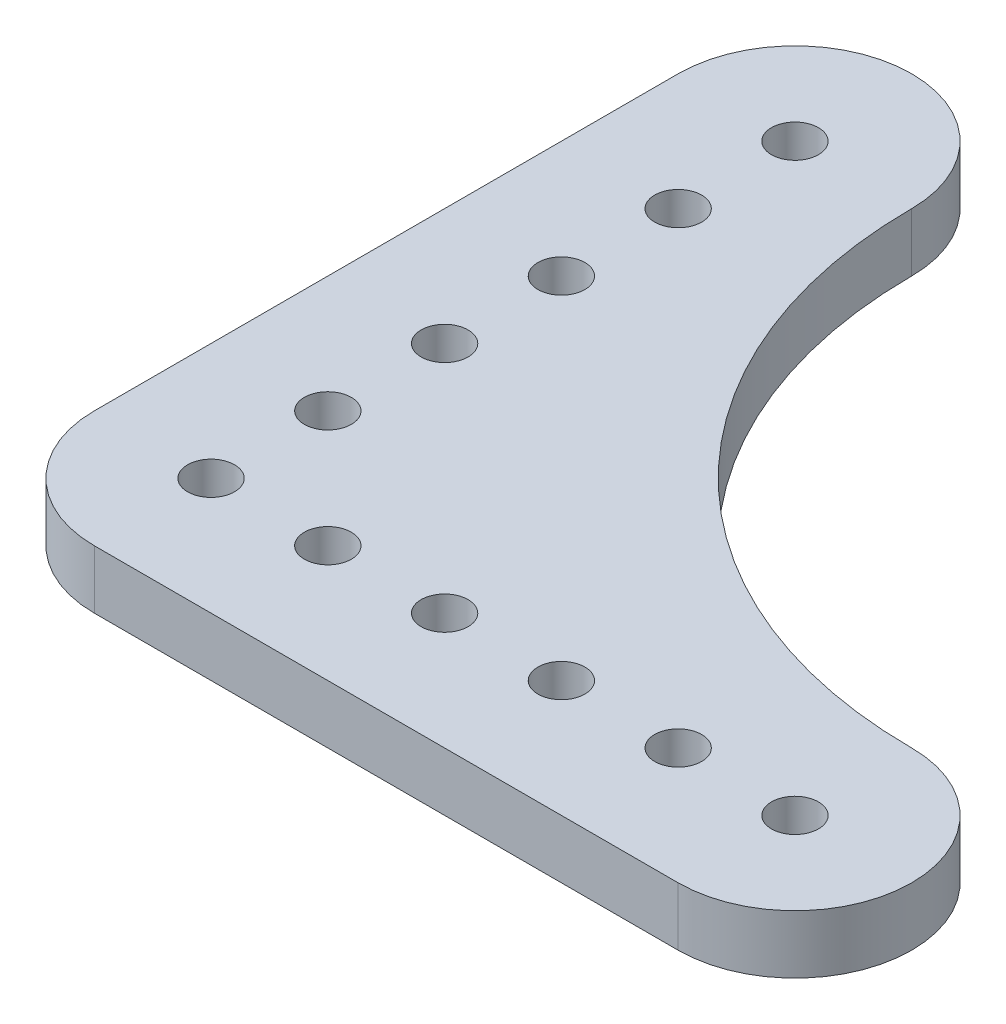
ISO-10303-21;
HEADER;
FILE_DESCRIPTION(('STEP AP214'),'2;1');
FILE_NAME('part.step','',(''),(''),'','','');
FILE_SCHEMA(('AUTOMOTIVE_DESIGN { 1 0 10303 214 1 1 1 1 }'));
ENDSEC;
DATA;
#1=APPLICATION_CONTEXT('core data for automotive mechanical design processes');
#2=APPLICATION_PROTOCOL_DEFINITION('international standard','automotive_design',2000,#1);
#3=PRODUCT_CONTEXT('',#1,'mechanical');
#4=PRODUCT('Part','Part','',(#3));
#5=PRODUCT_RELATED_PRODUCT_CATEGORY('part','',(#4));
#6=PRODUCT_DEFINITION_FORMATION('','',#4);
#7=PRODUCT_DEFINITION_CONTEXT('part definition',#1,'design');
#8=PRODUCT_DEFINITION('design','',#6,#7);
#9=PRODUCT_DEFINITION_SHAPE('','',#8);
#10=(LENGTH_UNIT() NAMED_UNIT(*) SI_UNIT(.MILLI.,.METRE.));
#11=(NAMED_UNIT(*) PLANE_ANGLE_UNIT() SI_UNIT($,.RADIAN.));
#12=(NAMED_UNIT(*) SI_UNIT($,.STERADIAN.) SOLID_ANGLE_UNIT());
#13=UNCERTAINTY_MEASURE_WITH_UNIT(LENGTH_MEASURE(1.E-05),#10,'distance_accuracy_value','');
#14=(GEOMETRIC_REPRESENTATION_CONTEXT(3) GLOBAL_UNCERTAINTY_ASSIGNED_CONTEXT((#13)) GLOBAL_UNIT_ASSIGNED_CONTEXT((#10,
#11,#12)) REPRESENTATION_CONTEXT('',''));
#15=CARTESIAN_POINT('',(0.,0.,0.));
#16=DIRECTION('',(0.,0.,1.));
#17=DIRECTION('',(1.,0.,0.));
#18=AXIS2_PLACEMENT_3D('',#15,#16,#17);
#19=CARTESIAN_POINT('',(-12.7,3.175,0.));
#20=DIRECTION('',(-1.,0.,0.));
#21=DIRECTION('',(0.,0.,1.));
#22=AXIS2_PLACEMENT_3D('',#19,#20,#21);
#23=PLANE('',#22);
#24=DIRECTION('',(0.,0.,-1.));
#25=VECTOR('',#24,1.);
#26=CARTESIAN_POINT('',(-12.7,-3.175,0.));
#27=LINE('',#26,#25);
#28=CARTESIAN_POINT('',(-12.7,-3.175,0.));
#29=VERTEX_POINT('',#28);
#30=CARTESIAN_POINT('',(-12.7,-3.175,-63.5));
#31=VERTEX_POINT('',#30);
#32=EDGE_CURVE('E150',#29,#31,#27,.T.);
#33=ORIENTED_EDGE('',*,*,#32,.F.);
#34=DIRECTION('',(0.,-1.,0.));
#35=VECTOR('',#34,1.);
#36=CARTESIAN_POINT('',(-12.7,3.175,0.));
#37=LINE('',#36,#35);
#38=CARTESIAN_POINT('',(-12.7,3.175,0.));
#39=VERTEX_POINT('',#38);
#40=EDGE_CURVE('E11',#39,#29,#37,.T.);
#41=ORIENTED_EDGE('',*,*,#40,.F.);
#42=DIRECTION('',(0.,0.,-1.));
#43=VECTOR('',#42,1.);
#44=CARTESIAN_POINT('',(-12.7,3.175,0.));
#45=LINE('',#44,#43);
#46=CARTESIAN_POINT('',(-12.7,3.175,-63.5));
#47=VERTEX_POINT('',#46);
#48=EDGE_CURVE('E208',#39,#47,#45,.T.);
#49=ORIENTED_EDGE('',*,*,#48,.T.);
#50=DIRECTION('',(0.,-1.,0.));
#51=VECTOR('',#50,1.);
#52=CARTESIAN_POINT('',(-12.7,3.175,-63.5));
#53=LINE('',#52,#51);
#54=EDGE_CURVE('E79',#47,#31,#53,.T.);
#55=ORIENTED_EDGE('',*,*,#54,.T.);
#56=EDGE_LOOP('',(#33,#41,#49,#55));
#57=FACE_BOUND('',#56,.T.);
#58=ADVANCED_FACE('F34',(#57),#23,.T.);
#59=CARTESIAN_POINT('',(0.,3.175,0.));
#60=DIRECTION('',(0.,-1.,0.));
#61=DIRECTION('',(0.,0.,-1.));
#62=AXIS2_PLACEMENT_3D('',#59,#60,#61);
#63=CYLINDRICAL_SURFACE('',#62,12.7);
#64=CARTESIAN_POINT('',(0.,-3.175,0.));
#65=DIRECTION('',(0.,1.,0.));
#66=DIRECTION('',(0.,0.,1.));
#67=AXIS2_PLACEMENT_3D('',#64,#65,#66);
#68=CIRCLE('',#67,12.7);
#69=CARTESIAN_POINT('',(0.,-3.175,12.7));
#70=VERTEX_POINT('',#69);
#71=EDGE_CURVE('E153',#29,#70,#68,.T.);
#72=ORIENTED_EDGE('',*,*,#71,.T.);
#73=DIRECTION('',(0.,-1.,0.));
#74=VECTOR('',#73,1.);
#75=CARTESIAN_POINT('',(0.,3.175,12.7));
#76=LINE('',#75,#74);
#77=CARTESIAN_POINT('',(0.,3.175,12.7));
#78=VERTEX_POINT('',#77);
#79=EDGE_CURVE('E43',#78,#70,#76,.T.);
#80=ORIENTED_EDGE('',*,*,#79,.F.);
#81=CARTESIAN_POINT('',(0.,3.175,0.));
#82=DIRECTION('',(0.,1.,0.));
#83=DIRECTION('',(0.,0.,1.));
#84=AXIS2_PLACEMENT_3D('',#81,#82,#83);
#85=CIRCLE('',#84,12.7);
#86=EDGE_CURVE('E209',#39,#78,#85,.T.);
#87=ORIENTED_EDGE('',*,*,#86,.F.);
#88=ORIENTED_EDGE('',*,*,#40,.T.);
#89=EDGE_LOOP('',(#72,#80,#87,#88));
#90=FACE_BOUND('',#89,.T.);
#91=ADVANCED_FACE('F203',(#90),#63,.T.);
#92=CARTESIAN_POINT('',(0.,3.175,12.7));
#93=DIRECTION('',(0.,0.,1.));
#94=DIRECTION('',(1.,0.,0.));
#95=AXIS2_PLACEMENT_3D('',#92,#93,#94);
#96=PLANE('',#95);
#97=DIRECTION('',(-1.,0.,0.));
#98=VECTOR('',#97,1.);
#99=CARTESIAN_POINT('',(0.,-3.175,12.7));
#100=LINE('',#99,#98);
#101=CARTESIAN_POINT('',(63.5,-3.175,12.7));
#102=VERTEX_POINT('',#101);
#103=EDGE_CURVE('E156',#102,#70,#100,.T.);
#104=ORIENTED_EDGE('',*,*,#103,.F.);
#105=DIRECTION('',(0.,-1.,0.));
#106=VECTOR('',#105,1.);
#107=CARTESIAN_POINT('',(63.5,3.175,12.7));
#108=LINE('',#107,#106);
#109=CARTESIAN_POINT('',(63.5,3.175,12.7));
#110=VERTEX_POINT('',#109);
#111=EDGE_CURVE('E110',#110,#102,#108,.T.);
#112=ORIENTED_EDGE('',*,*,#111,.F.);
#113=DIRECTION('',(-1.,0.,0.));
#114=VECTOR('',#113,1.);
#115=CARTESIAN_POINT('',(0.,3.175,12.7));
#116=LINE('',#115,#114);
#117=EDGE_CURVE('E99',#110,#78,#116,.T.);
#118=ORIENTED_EDGE('',*,*,#117,.T.);
#119=ORIENTED_EDGE('',*,*,#79,.T.);
#120=EDGE_LOOP('',(#104,#112,#118,#119));
#121=FACE_BOUND('',#120,.T.);
#122=ADVANCED_FACE('F200',(#121),#96,.T.);
#123=CARTESIAN_POINT('',(63.5,3.175,0.));
#124=DIRECTION('',(0.,-1.,0.));
#125=DIRECTION('',(0.,0.,-1.));
#126=AXIS2_PLACEMENT_3D('',#123,#124,#125);
#127=CYLINDRICAL_SURFACE('',#126,12.7);
#128=CARTESIAN_POINT('',(63.5,-3.175,0.));
#129=DIRECTION('',(0.,1.,0.));
#130=DIRECTION('',(0.,0.,1.));
#131=AXIS2_PLACEMENT_3D('',#128,#129,#130);
#132=CIRCLE('',#131,12.7);
#133=CARTESIAN_POINT('',(63.5,-3.175,-12.7));
#134=VERTEX_POINT('',#133);
#135=EDGE_CURVE('E106',#102,#134,#132,.T.);
#136=ORIENTED_EDGE('',*,*,#135,.T.);
#137=DIRECTION('',(0.,-1.,0.));
#138=VECTOR('',#137,1.);
#139=CARTESIAN_POINT('',(63.5,3.175,-12.7));
#140=LINE('',#139,#138);
#141=CARTESIAN_POINT('',(63.5,3.175,-12.7));
#142=VERTEX_POINT('',#141);
#143=EDGE_CURVE('E103',#142,#134,#140,.T.);
#144=ORIENTED_EDGE('',*,*,#143,.F.);
#145=CARTESIAN_POINT('',(63.5,3.175,0.));
#146=DIRECTION('',(0.,1.,0.));
#147=DIRECTION('',(0.,0.,1.));
#148=AXIS2_PLACEMENT_3D('',#145,#146,#147);
#149=CIRCLE('',#148,12.7);
#150=EDGE_CURVE('E92',#110,#142,#149,.T.);
#151=ORIENTED_EDGE('',*,*,#150,.F.);
#152=ORIENTED_EDGE('',*,*,#111,.T.);
#153=EDGE_LOOP('',(#136,#144,#151,#152));
#154=FACE_BOUND('',#153,.T.);
#155=ADVANCED_FACE('F104',(#154),#127,.T.);
#156=CARTESIAN_POINT('',(63.5,3.175,-63.5));
#157=DIRECTION('',(0.,-1.,0.));
#158=DIRECTION('',(0.,0.,-1.));
#159=AXIS2_PLACEMENT_3D('',#156,#157,#158);
#160=CYLINDRICAL_SURFACE('',#159,50.8);
#161=CARTESIAN_POINT('',(63.5,-3.175,-63.5));
#162=DIRECTION('',(0.,1.,0.));
#163=DIRECTION('',(0.,0.,1.));
#164=AXIS2_PLACEMENT_3D('',#161,#162,#163);
#165=CIRCLE('',#164,50.8);
#166=CARTESIAN_POINT('',(12.7,-3.175,-63.5));
#167=VERTEX_POINT('',#166);
#168=EDGE_CURVE('E160',#167,#134,#165,.T.);
#169=ORIENTED_EDGE('',*,*,#168,.F.);
#170=DIRECTION('',(0.,-1.,0.));
#171=VECTOR('',#170,1.);
#172=CARTESIAN_POINT('',(12.7,3.175,-63.5));
#173=LINE('',#172,#171);
#174=CARTESIAN_POINT('',(12.7,3.175,-63.5));
#175=VERTEX_POINT('',#174);
#176=EDGE_CURVE('E72',#175,#167,#173,.T.);
#177=ORIENTED_EDGE('',*,*,#176,.F.);
#178=CARTESIAN_POINT('',(63.5,3.175,-63.5));
#179=DIRECTION('',(0.,1.,0.));
#180=DIRECTION('',(0.,0.,1.));
#181=AXIS2_PLACEMENT_3D('',#178,#179,#180);
#182=CIRCLE('',#181,50.8);
#183=EDGE_CURVE('E97',#175,#142,#182,.T.);
#184=ORIENTED_EDGE('',*,*,#183,.T.);
#185=ORIENTED_EDGE('',*,*,#143,.T.);
#186=EDGE_LOOP('',(#169,#177,#184,#185));
#187=FACE_BOUND('',#186,.T.);
#188=ADVANCED_FACE('F112',(#187),#160,.F.);
#189=CARTESIAN_POINT('',(50.8,3.175,0.));
#190=DIRECTION('',(0.,-1.,0.));
#191=DIRECTION('',(0.,0.,-1.));
#192=AXIS2_PLACEMENT_3D('',#189,#190,#191);
#193=CYLINDRICAL_SURFACE('',#192,2.5527);
#194=CARTESIAN_POINT('',(50.8,3.175,0.));
#195=DIRECTION('',(0.,1.,0.));
#196=DIRECTION('',(0.,0.,1.));
#197=AXIS2_PLACEMENT_3D('',#194,#195,#196);
#198=CIRCLE('',#197,2.5527);
#199=CARTESIAN_POINT('',(50.8,3.175,2.5527));
#200=VERTEX_POINT('',#199);
#201=EDGE_CURVE('E141',#200,#200,#198,.T.);
#202=ORIENTED_EDGE('',*,*,#201,.T.);
#203=EDGE_LOOP('',(#202));
#204=FACE_BOUND('',#203,.T.);
#205=CARTESIAN_POINT('',(50.8,-3.175,0.));
#206=DIRECTION('',(0.,1.,0.));
#207=DIRECTION('',(0.,0.,1.));
#208=AXIS2_PLACEMENT_3D('',#205,#206,#207);
#209=CIRCLE('',#208,2.5527);
#210=CARTESIAN_POINT('',(50.8,-3.175,2.5527));
#211=VERTEX_POINT('',#210);
#212=EDGE_CURVE('E188',#211,#211,#209,.T.);
#213=ORIENTED_EDGE('',*,*,#212,.F.);
#214=EDGE_LOOP('',(#213));
#215=FACE_BOUND('',#214,.T.);
#216=ADVANCED_FACE('F241',(#204,#215),#193,.F.);
#217=CARTESIAN_POINT('',(38.1,3.175,0.));
#218=DIRECTION('',(0.,-1.,0.));
#219=DIRECTION('',(0.,0.,-1.));
#220=AXIS2_PLACEMENT_3D('',#217,#218,#219);
#221=CYLINDRICAL_SURFACE('',#220,2.5527);
#222=CARTESIAN_POINT('',(38.1,3.175,0.));
#223=DIRECTION('',(0.,1.,0.));
#224=DIRECTION('',(0.,0.,1.));
#225=AXIS2_PLACEMENT_3D('',#222,#223,#224);
#226=CIRCLE('',#225,2.5527);
#227=CARTESIAN_POINT('',(38.1,3.175,2.5527));
#228=VERTEX_POINT('',#227);
#229=EDGE_CURVE('E138',#228,#228,#226,.T.);
#230=ORIENTED_EDGE('',*,*,#229,.T.);
#231=EDGE_LOOP('',(#230));
#232=FACE_BOUND('',#231,.T.);
#233=CARTESIAN_POINT('',(38.1,-3.175,0.));
#234=DIRECTION('',(0.,1.,0.));
#235=DIRECTION('',(0.,0.,1.));
#236=AXIS2_PLACEMENT_3D('',#233,#234,#235);
#237=CIRCLE('',#236,2.5527);
#238=CARTESIAN_POINT('',(38.1,-3.175,2.5527));
#239=VERTEX_POINT('',#238);
#240=EDGE_CURVE('E185',#239,#239,#237,.T.);
#241=ORIENTED_EDGE('',*,*,#240,.F.);
#242=EDGE_LOOP('',(#241));
#243=FACE_BOUND('',#242,.T.);
#244=ADVANCED_FACE('F271',(#232,#243),#221,.F.);
#245=CARTESIAN_POINT('',(25.4,3.175,0.));
#246=DIRECTION('',(0.,-1.,0.));
#247=DIRECTION('',(0.,0.,-1.));
#248=AXIS2_PLACEMENT_3D('',#245,#246,#247);
#249=CYLINDRICAL_SURFACE('',#248,2.5527);
#250=CARTESIAN_POINT('',(25.4,3.175,0.));
#251=DIRECTION('',(0.,1.,0.));
#252=DIRECTION('',(0.,0.,1.));
#253=AXIS2_PLACEMENT_3D('',#250,#251,#252);
#254=CIRCLE('',#253,2.5527);
#255=CARTESIAN_POINT('',(25.4,3.175,2.5527));
#256=VERTEX_POINT('',#255);
#257=EDGE_CURVE('E135',#256,#256,#254,.T.);
#258=ORIENTED_EDGE('',*,*,#257,.T.);
#259=EDGE_LOOP('',(#258));
#260=FACE_BOUND('',#259,.T.);
#261=CARTESIAN_POINT('',(25.4,-3.175,0.));
#262=DIRECTION('',(0.,1.,0.));
#263=DIRECTION('',(0.,0.,1.));
#264=AXIS2_PLACEMENT_3D('',#261,#262,#263);
#265=CIRCLE('',#264,2.5527);
#266=CARTESIAN_POINT('',(25.4,-3.175,2.5527));
#267=VERTEX_POINT('',#266);
#268=EDGE_CURVE('E182',#267,#267,#265,.T.);
#269=ORIENTED_EDGE('',*,*,#268,.F.);
#270=EDGE_LOOP('',(#269));
#271=FACE_BOUND('',#270,.T.);
#272=ADVANCED_FACE('F267',(#260,#271),#249,.F.);
#273=CARTESIAN_POINT('',(0.,3.175,0.));
#274=DIRECTION('',(0.,-1.,0.));
#275=DIRECTION('',(0.,0.,-1.));
#276=AXIS2_PLACEMENT_3D('',#273,#274,#275);
#277=CYLINDRICAL_SURFACE('',#276,2.5527);
#278=CARTESIAN_POINT('',(0.,3.175,0.));
#279=DIRECTION('',(0.,1.,0.));
#280=DIRECTION('',(0.,0.,1.));
#281=AXIS2_PLACEMENT_3D('',#278,#279,#280);
#282=CIRCLE('',#281,2.5527);
#283=CARTESIAN_POINT('',(0.,3.175,2.5527));
#284=VERTEX_POINT('',#283);
#285=EDGE_CURVE('E132',#284,#284,#282,.T.);
#286=ORIENTED_EDGE('',*,*,#285,.T.);
#287=EDGE_LOOP('',(#286));
#288=FACE_BOUND('',#287,.T.);
#289=CARTESIAN_POINT('',(0.,-3.175,0.));
#290=DIRECTION('',(0.,1.,0.));
#291=DIRECTION('',(0.,0.,1.));
#292=AXIS2_PLACEMENT_3D('',#289,#290,#291);
#293=CIRCLE('',#292,2.5527);
#294=CARTESIAN_POINT('',(0.,-3.175,2.5527));
#295=VERTEX_POINT('',#294);
#296=EDGE_CURVE('E179',#295,#295,#293,.T.);
#297=ORIENTED_EDGE('',*,*,#296,.F.);
#298=EDGE_LOOP('',(#297));
#299=FACE_BOUND('',#298,.T.);
#300=ADVANCED_FACE('F263',(#288,#299),#277,.F.);
#301=CARTESIAN_POINT('',(0.,3.175,-12.7));
#302=DIRECTION('',(0.,-1.,0.));
#303=DIRECTION('',(0.,0.,-1.));
#304=AXIS2_PLACEMENT_3D('',#301,#302,#303);
#305=CYLINDRICAL_SURFACE('',#304,2.5527);
#306=CARTESIAN_POINT('',(0.,3.175,-12.7));
#307=DIRECTION('',(0.,1.,0.));
#308=DIRECTION('',(0.,0.,1.));
#309=AXIS2_PLACEMENT_3D('',#306,#307,#308);
#310=CIRCLE('',#309,2.5527);
#311=CARTESIAN_POINT('',(0.,3.175,-10.1473));
#312=VERTEX_POINT('',#311);
#313=EDGE_CURVE('E129',#312,#312,#310,.T.);
#314=ORIENTED_EDGE('',*,*,#313,.T.);
#315=EDGE_LOOP('',(#314));
#316=FACE_BOUND('',#315,.T.);
#317=CARTESIAN_POINT('',(0.,-3.175,-12.7));
#318=DIRECTION('',(0.,1.,0.));
#319=DIRECTION('',(0.,0.,1.));
#320=AXIS2_PLACEMENT_3D('',#317,#318,#319);
#321=CIRCLE('',#320,2.5527);
#322=CARTESIAN_POINT('',(0.,-3.175,-10.1473));
#323=VERTEX_POINT('',#322);
#324=EDGE_CURVE('E176',#323,#323,#321,.T.);
#325=ORIENTED_EDGE('',*,*,#324,.F.);
#326=EDGE_LOOP('',(#325));
#327=FACE_BOUND('',#326,.T.);
#328=ADVANCED_FACE('F259',(#316,#327),#305,.F.);
#329=CARTESIAN_POINT('',(0.,3.175,-63.5));
#330=DIRECTION('',(0.,-1.,0.));
#331=DIRECTION('',(0.,0.,-1.));
#332=AXIS2_PLACEMENT_3D('',#329,#330,#331);
#333=CYLINDRICAL_SURFACE('',#332,2.5527);
#334=CARTESIAN_POINT('',(0.,3.175,-63.5));
#335=DIRECTION('',(0.,1.,0.));
#336=DIRECTION('',(0.,0.,1.));
#337=AXIS2_PLACEMENT_3D('',#334,#335,#336);
#338=CIRCLE('',#337,2.5527);
#339=CARTESIAN_POINT('',(0.,3.175,-60.9473));
#340=VERTEX_POINT('',#339);
#341=EDGE_CURVE('E126',#340,#340,#338,.T.);
#342=ORIENTED_EDGE('',*,*,#341,.T.);
#343=EDGE_LOOP('',(#342));
#344=FACE_BOUND('',#343,.T.);
#345=CARTESIAN_POINT('',(0.,-3.175,-63.5));
#346=DIRECTION('',(0.,1.,0.));
#347=DIRECTION('',(0.,0.,1.));
#348=AXIS2_PLACEMENT_3D('',#345,#346,#347);
#349=CIRCLE('',#348,2.5527);
#350=CARTESIAN_POINT('',(0.,-3.175,-60.9473));
#351=VERTEX_POINT('',#350);
#352=EDGE_CURVE('E173',#351,#351,#349,.T.);
#353=ORIENTED_EDGE('',*,*,#352,.F.);
#354=EDGE_LOOP('',(#353));
#355=FACE_BOUND('',#354,.T.);
#356=ADVANCED_FACE('F255',(#344,#355),#333,.F.);
#357=CARTESIAN_POINT('',(0.,3.175,-50.8));
#358=DIRECTION('',(0.,-1.,0.));
#359=DIRECTION('',(0.,0.,-1.));
#360=AXIS2_PLACEMENT_3D('',#357,#358,#359);
#361=CYLINDRICAL_SURFACE('',#360,2.5527);
#362=CARTESIAN_POINT('',(0.,3.175,-50.8));
#363=DIRECTION('',(0.,1.,0.));
#364=DIRECTION('',(0.,0.,1.));
#365=AXIS2_PLACEMENT_3D('',#362,#363,#364);
#366=CIRCLE('',#365,2.5527);
#367=CARTESIAN_POINT('',(0.,3.175,-48.2473));
#368=VERTEX_POINT('',#367);
#369=EDGE_CURVE('E123',#368,#368,#366,.T.);
#370=ORIENTED_EDGE('',*,*,#369,.T.);
#371=EDGE_LOOP('',(#370));
#372=FACE_BOUND('',#371,.T.);
#373=CARTESIAN_POINT('',(0.,-3.175,-50.8));
#374=DIRECTION('',(0.,1.,0.));
#375=DIRECTION('',(0.,0.,1.));
#376=AXIS2_PLACEMENT_3D('',#373,#374,#375);
#377=CIRCLE('',#376,2.5527);
#378=CARTESIAN_POINT('',(0.,-3.175,-48.2473));
#379=VERTEX_POINT('',#378);
#380=EDGE_CURVE('E170',#379,#379,#377,.T.);
#381=ORIENTED_EDGE('',*,*,#380,.F.);
#382=EDGE_LOOP('',(#381));
#383=FACE_BOUND('',#382,.T.);
#384=ADVANCED_FACE('F251',(#372,#383),#361,.F.);
#385=CARTESIAN_POINT('',(0.,3.175,-38.1));
#386=DIRECTION('',(0.,-1.,0.));
#387=DIRECTION('',(0.,0.,-1.));
#388=AXIS2_PLACEMENT_3D('',#385,#386,#387);
#389=CYLINDRICAL_SURFACE('',#388,2.5527);
#390=CARTESIAN_POINT('',(0.,3.175,-38.1));
#391=DIRECTION('',(0.,1.,0.));
#392=DIRECTION('',(0.,0.,1.));
#393=AXIS2_PLACEMENT_3D('',#390,#391,#392);
#394=CIRCLE('',#393,2.5527);
#395=CARTESIAN_POINT('',(0.,3.175,-35.5473));
#396=VERTEX_POINT('',#395);
#397=EDGE_CURVE('E120',#396,#396,#394,.T.);
#398=ORIENTED_EDGE('',*,*,#397,.T.);
#399=EDGE_LOOP('',(#398));
#400=FACE_BOUND('',#399,.T.);
#401=CARTESIAN_POINT('',(0.,-3.175,-38.1));
#402=DIRECTION('',(0.,1.,0.));
#403=DIRECTION('',(0.,0.,1.));
#404=AXIS2_PLACEMENT_3D('',#401,#402,#403);
#405=CIRCLE('',#404,2.5527);
#406=CARTESIAN_POINT('',(0.,-3.175,-35.5473));
#407=VERTEX_POINT('',#406);
#408=EDGE_CURVE('E167',#407,#407,#405,.T.);
#409=ORIENTED_EDGE('',*,*,#408,.F.);
#410=EDGE_LOOP('',(#409));
#411=FACE_BOUND('',#410,.T.);
#412=ADVANCED_FACE('F247',(#400,#411),#389,.F.);
#413=CARTESIAN_POINT('',(0.,3.175,-25.4));
#414=DIRECTION('',(0.,-1.,0.));
#415=DIRECTION('',(0.,0.,-1.));
#416=AXIS2_PLACEMENT_3D('',#413,#414,#415);
#417=CYLINDRICAL_SURFACE('',#416,2.5527);
#418=CARTESIAN_POINT('',(0.,3.175,-25.4));
#419=DIRECTION('',(0.,1.,0.));
#420=DIRECTION('',(0.,0.,1.));
#421=AXIS2_PLACEMENT_3D('',#418,#419,#420);
#422=CIRCLE('',#421,2.5527);
#423=CARTESIAN_POINT('',(0.,3.175,-22.8473));
#424=VERTEX_POINT('',#423);
#425=EDGE_CURVE('E114',#424,#424,#422,.T.);
#426=ORIENTED_EDGE('',*,*,#425,.T.);
#427=EDGE_LOOP('',(#426));
#428=FACE_BOUND('',#427,.T.);
#429=CARTESIAN_POINT('',(0.,-3.175,-25.4));
#430=DIRECTION('',(0.,1.,0.));
#431=DIRECTION('',(0.,0.,1.));
#432=AXIS2_PLACEMENT_3D('',#429,#430,#431);
#433=CIRCLE('',#432,2.5527);
#434=CARTESIAN_POINT('',(0.,-3.175,-22.8473));
#435=VERTEX_POINT('',#434);
#436=EDGE_CURVE('E164',#435,#435,#433,.T.);
#437=ORIENTED_EDGE('',*,*,#436,.F.);
#438=EDGE_LOOP('',(#437));
#439=FACE_BOUND('',#438,.T.);
#440=ADVANCED_FACE('F244',(#428,#439),#417,.F.);
#441=CARTESIAN_POINT('',(0.,3.175,-63.5));
#442=DIRECTION('',(0.,-1.,0.));
#443=DIRECTION('',(0.,0.,-1.));
#444=AXIS2_PLACEMENT_3D('',#441,#442,#443);
#445=CYLINDRICAL_SURFACE('',#444,12.7);
#446=CARTESIAN_POINT('',(0.,-3.175,-63.5));
#447=DIRECTION('',(0.,1.,0.));
#448=DIRECTION('',(0.,0.,1.));
#449=AXIS2_PLACEMENT_3D('',#446,#447,#448);
#450=CIRCLE('',#449,12.7);
#451=EDGE_CURVE('E162',#167,#31,#450,.T.);
#452=ORIENTED_EDGE('',*,*,#451,.T.);
#453=ORIENTED_EDGE('',*,*,#54,.F.);
#454=CARTESIAN_POINT('',(0.,3.175,-63.5));
#455=DIRECTION('',(0.,1.,0.));
#456=DIRECTION('',(0.,0.,1.));
#457=AXIS2_PLACEMENT_3D('',#454,#455,#456);
#458=CIRCLE('',#457,12.7);
#459=EDGE_CURVE('E51',#175,#47,#458,.T.);
#460=ORIENTED_EDGE('',*,*,#459,.F.);
#461=ORIENTED_EDGE('',*,*,#176,.T.);
#462=EDGE_LOOP('',(#452,#453,#460,#461));
#463=FACE_BOUND('',#462,.T.);
#464=ADVANCED_FACE('F207',(#463),#445,.T.);
#465=CARTESIAN_POINT('',(12.7,3.175,0.));
#466=DIRECTION('',(0.,-1.,0.));
#467=DIRECTION('',(0.,0.,-1.));
#468=AXIS2_PLACEMENT_3D('',#465,#466,#467);
#469=CYLINDRICAL_SURFACE('',#468,2.5527);
#470=CARTESIAN_POINT('',(12.7,3.175,0.));
#471=DIRECTION('',(0.,1.,0.));
#472=DIRECTION('',(0.,0.,1.));
#473=AXIS2_PLACEMENT_3D('',#470,#471,#472);
#474=CIRCLE('',#473,2.5527);
#475=CARTESIAN_POINT('',(12.7,3.175,2.5527));
#476=VERTEX_POINT('',#475);
#477=EDGE_CURVE('E194',#476,#476,#474,.T.);
#478=ORIENTED_EDGE('',*,*,#477,.T.);
#479=EDGE_LOOP('',(#478));
#480=FACE_BOUND('',#479,.T.);
#481=CARTESIAN_POINT('',(12.7,-3.175,0.));
#482=DIRECTION('',(0.,1.,0.));
#483=DIRECTION('',(0.,0.,1.));
#484=AXIS2_PLACEMENT_3D('',#481,#482,#483);
#485=CIRCLE('',#484,2.5527);
#486=CARTESIAN_POINT('',(12.7,-3.175,2.5527));
#487=VERTEX_POINT('',#486);
#488=EDGE_CURVE('E147',#487,#487,#485,.T.);
#489=ORIENTED_EDGE('',*,*,#488,.F.);
#490=EDGE_LOOP('',(#489));
#491=FACE_BOUND('',#490,.T.);
#492=ADVANCED_FACE('F36',(#480,#491),#469,.F.);
#493=CARTESIAN_POINT('',(63.5,3.175,0.));
#494=DIRECTION('',(0.,-1.,0.));
#495=DIRECTION('',(0.,0.,-1.));
#496=AXIS2_PLACEMENT_3D('',#493,#494,#495);
#497=CYLINDRICAL_SURFACE('',#496,2.5527);
#498=CARTESIAN_POINT('',(63.5,3.175,0.));
#499=DIRECTION('',(0.,1.,0.));
#500=DIRECTION('',(0.,0.,1.));
#501=AXIS2_PLACEMENT_3D('',#498,#499,#500);
#502=CIRCLE('',#501,2.5527);
#503=CARTESIAN_POINT('',(63.5,3.175,2.5527));
#504=VERTEX_POINT('',#503);
#505=EDGE_CURVE('E144',#504,#504,#502,.T.);
#506=ORIENTED_EDGE('',*,*,#505,.T.);
#507=EDGE_LOOP('',(#506));
#508=FACE_BOUND('',#507,.T.);
#509=CARTESIAN_POINT('',(63.5,-3.175,0.));
#510=DIRECTION('',(0.,1.,0.));
#511=DIRECTION('',(0.,0.,1.));
#512=AXIS2_PLACEMENT_3D('',#509,#510,#511);
#513=CIRCLE('',#512,2.5527);
#514=CARTESIAN_POINT('',(63.5,-3.175,2.5527));
#515=VERTEX_POINT('',#514);
#516=EDGE_CURVE('E191',#515,#515,#513,.T.);
#517=ORIENTED_EDGE('',*,*,#516,.F.);
#518=EDGE_LOOP('',(#517));
#519=FACE_BOUND('',#518,.T.);
#520=ADVANCED_FACE('F219',(#508,#519),#497,.F.);
#521=CARTESIAN_POINT('',(0.,3.175,0.));
#522=DIRECTION('',(0.,1.,0.));
#523=DIRECTION('',(0.,0.,1.));
#524=AXIS2_PLACEMENT_3D('',#521,#522,#523);
#525=PLANE('',#524);
#526=ORIENTED_EDGE('',*,*,#477,.F.);
#527=EDGE_LOOP('',(#526));
#528=FACE_BOUND('',#527,.T.);
#529=ORIENTED_EDGE('',*,*,#48,.F.);
#530=ORIENTED_EDGE('',*,*,#86,.T.);
#531=ORIENTED_EDGE('',*,*,#117,.F.);
#532=ORIENTED_EDGE('',*,*,#150,.T.);
#533=ORIENTED_EDGE('',*,*,#183,.F.);
#534=ORIENTED_EDGE('',*,*,#459,.T.);
#535=EDGE_LOOP('',(#529,#530,#531,#532,#533,#534));
#536=FACE_BOUND('',#535,.T.);
#537=ORIENTED_EDGE('',*,*,#425,.F.);
#538=EDGE_LOOP('',(#537));
#539=FACE_BOUND('',#538,.T.);
#540=ORIENTED_EDGE('',*,*,#397,.F.);
#541=EDGE_LOOP('',(#540));
#542=FACE_BOUND('',#541,.T.);
#543=ORIENTED_EDGE('',*,*,#369,.F.);
#544=EDGE_LOOP('',(#543));
#545=FACE_BOUND('',#544,.T.);
#546=ORIENTED_EDGE('',*,*,#341,.F.);
#547=EDGE_LOOP('',(#546));
#548=FACE_BOUND('',#547,.T.);
#549=ORIENTED_EDGE('',*,*,#313,.F.);
#550=EDGE_LOOP('',(#549));
#551=FACE_BOUND('',#550,.T.);
#552=ORIENTED_EDGE('',*,*,#285,.F.);
#553=EDGE_LOOP('',(#552));
#554=FACE_BOUND('',#553,.T.);
#555=ORIENTED_EDGE('',*,*,#257,.F.);
#556=EDGE_LOOP('',(#555));
#557=FACE_BOUND('',#556,.T.);
#558=ORIENTED_EDGE('',*,*,#229,.F.);
#559=EDGE_LOOP('',(#558));
#560=FACE_BOUND('',#559,.T.);
#561=ORIENTED_EDGE('',*,*,#201,.F.);
#562=EDGE_LOOP('',(#561));
#563=FACE_BOUND('',#562,.T.);
#564=ORIENTED_EDGE('',*,*,#505,.F.);
#565=EDGE_LOOP('',(#564));
#566=FACE_BOUND('',#565,.T.);
#567=ADVANCED_FACE('F94',(#528,#536,#539,#542,#545,#548,#551,#554,#557,#560,#563,#566),#525,.T.);
#568=CARTESIAN_POINT('',(0.,-3.175,0.));
#569=DIRECTION('',(0.,1.,0.));
#570=DIRECTION('',(0.,0.,1.));
#571=AXIS2_PLACEMENT_3D('',#568,#569,#570);
#572=PLANE('',#571);
#573=ORIENTED_EDGE('',*,*,#488,.T.);
#574=EDGE_LOOP('',(#573));
#575=FACE_BOUND('',#574,.T.);
#576=ORIENTED_EDGE('',*,*,#32,.T.);
#577=ORIENTED_EDGE('',*,*,#451,.F.);
#578=ORIENTED_EDGE('',*,*,#168,.T.);
#579=ORIENTED_EDGE('',*,*,#135,.F.);
#580=ORIENTED_EDGE('',*,*,#103,.T.);
#581=ORIENTED_EDGE('',*,*,#71,.F.);
#582=EDGE_LOOP('',(#576,#577,#578,#579,#580,#581));
#583=FACE_BOUND('',#582,.T.);
#584=ORIENTED_EDGE('',*,*,#436,.T.);
#585=EDGE_LOOP('',(#584));
#586=FACE_BOUND('',#585,.T.);
#587=ORIENTED_EDGE('',*,*,#408,.T.);
#588=EDGE_LOOP('',(#587));
#589=FACE_BOUND('',#588,.T.);
#590=ORIENTED_EDGE('',*,*,#380,.T.);
#591=EDGE_LOOP('',(#590));
#592=FACE_BOUND('',#591,.T.);
#593=ORIENTED_EDGE('',*,*,#352,.T.);
#594=EDGE_LOOP('',(#593));
#595=FACE_BOUND('',#594,.T.);
#596=ORIENTED_EDGE('',*,*,#324,.T.);
#597=EDGE_LOOP('',(#596));
#598=FACE_BOUND('',#597,.T.);
#599=ORIENTED_EDGE('',*,*,#296,.T.);
#600=EDGE_LOOP('',(#599));
#601=FACE_BOUND('',#600,.T.);
#602=ORIENTED_EDGE('',*,*,#268,.T.);
#603=EDGE_LOOP('',(#602));
#604=FACE_BOUND('',#603,.T.);
#605=ORIENTED_EDGE('',*,*,#240,.T.);
#606=EDGE_LOOP('',(#605));
#607=FACE_BOUND('',#606,.T.);
#608=ORIENTED_EDGE('',*,*,#212,.T.);
#609=EDGE_LOOP('',(#608));
#610=FACE_BOUND('',#609,.T.);
#611=ORIENTED_EDGE('',*,*,#516,.T.);
#612=EDGE_LOOP('',(#611));
#613=FACE_BOUND('',#612,.T.);
#614=ADVANCED_FACE('F205',(#575,#583,#586,#589,#592,#595,#598,#601,#604,#607,#610,#613),#572,.F.);
#615=CLOSED_SHELL('',(#58,#91,#122,#155,#188,#216,#244,#272,#300,#328,#356,#384,#412,#440,#464,
#492,#520,#567,#614));
#616=MANIFOLD_SOLID_BREP('B2',#615);
#617=ADVANCED_BREP_SHAPE_REPRESENTATION('',(#18,#616),#14);
#618=SHAPE_DEFINITION_REPRESENTATION(#9,#617);
ENDSEC;
END-ISO-10303-21;
